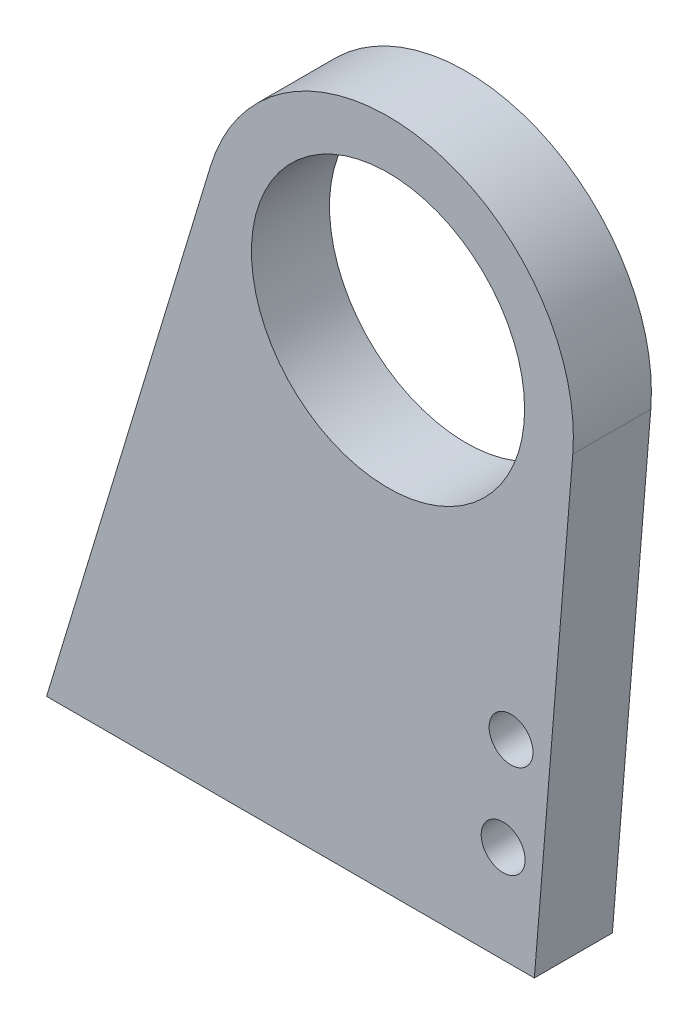
ISO-10303-21;
HEADER;
FILE_DESCRIPTION(('STEP AP214'),'2;1');
FILE_NAME('part.step','',(''),(''),'','','');
FILE_SCHEMA(('AUTOMOTIVE_DESIGN { 1 0 10303 214 1 1 1 1 }'));
ENDSEC;
DATA;
#1=APPLICATION_CONTEXT('core data for automotive mechanical design processes');
#2=APPLICATION_PROTOCOL_DEFINITION('international standard','automotive_design',2000,#1);
#3=PRODUCT_CONTEXT('',#1,'mechanical');
#4=PRODUCT('Part','Part','',(#3));
#5=PRODUCT_RELATED_PRODUCT_CATEGORY('part','',(#4));
#6=PRODUCT_DEFINITION_FORMATION('','',#4);
#7=PRODUCT_DEFINITION_CONTEXT('part definition',#1,'design');
#8=PRODUCT_DEFINITION('design','',#6,#7);
#9=PRODUCT_DEFINITION_SHAPE('','',#8);
#10=(LENGTH_UNIT() NAMED_UNIT(*) SI_UNIT(.MILLI.,.METRE.));
#11=(NAMED_UNIT(*) PLANE_ANGLE_UNIT() SI_UNIT($,.RADIAN.));
#12=(NAMED_UNIT(*) SI_UNIT($,.STERADIAN.) SOLID_ANGLE_UNIT());
#13=UNCERTAINTY_MEASURE_WITH_UNIT(LENGTH_MEASURE(1.E-05),#10,'distance_accuracy_value','');
#14=(GEOMETRIC_REPRESENTATION_CONTEXT(3) GLOBAL_UNCERTAINTY_ASSIGNED_CONTEXT((#13)) GLOBAL_UNIT_ASSIGNED_CONTEXT((#10,
#11,#12)) REPRESENTATION_CONTEXT('',''));
#15=CARTESIAN_POINT('',(0.,0.,0.));
#16=DIRECTION('',(0.,0.,1.));
#17=DIRECTION('',(1.,0.,0.));
#18=AXIS2_PLACEMENT_3D('',#15,#16,#17);
#19=CARTESIAN_POINT('',(49.6720681360177,-4.03597000629349,8.));
#20=DIRECTION('',(-0.99671528668941,0.0809854139931767,0.));
#21=DIRECTION('',(-0.0809854139931767,-0.996715286689411,0.));
#22=AXIS2_PLACEMENT_3D('',#19,#20,#21);
#23=PLANE('',#22);
#24=DIRECTION('',(0.0809854139931767,0.996715286689411,0.));
#25=VECTOR('',#24,1.);
#26=CARTESIAN_POINT('',(49.6720681360177,-4.03597000629349,0.));
#27=LINE('',#26,#25);
#28=CARTESIAN_POINT('',(50.,0.,0.));
#29=VERTEX_POINT('',#28);
#30=CARTESIAN_POINT('',(53.9375904470988,48.4612771341296,0.));
#31=VERTEX_POINT('',#30);
#32=EDGE_CURVE('E128',#29,#31,#27,.T.);
#33=ORIENTED_EDGE('',*,*,#32,.T.);
#34=DIRECTION('',(0.,0.,-1.));
#35=VECTOR('',#34,1.);
#36=CARTESIAN_POINT('',(53.9375904470988,48.4612771341296,8.));
#37=LINE('',#36,#35);
#38=CARTESIAN_POINT('',(53.9375904470988,48.4612771341296,8.));
#39=VERTEX_POINT('',#38);
#40=EDGE_CURVE('E11',#39,#31,#37,.T.);
#41=ORIENTED_EDGE('',*,*,#40,.F.);
#42=DIRECTION('',(0.0809854139931767,0.996715286689411,0.));
#43=VECTOR('',#42,1.);
#44=CARTESIAN_POINT('',(49.6720681360177,-4.03597000629349,8.));
#45=LINE('',#44,#43);
#46=CARTESIAN_POINT('',(50.,0.,8.));
#47=VERTEX_POINT('',#46);
#48=EDGE_CURVE('E129',#47,#39,#45,.T.);
#49=ORIENTED_EDGE('',*,*,#48,.F.);
#50=DIRECTION('',(0.,0.,-1.));
#51=VECTOR('',#50,1.);
#52=CARTESIAN_POINT('',(50.,0.,8.));
#53=LINE('',#52,#51);
#54=EDGE_CURVE('E140',#47,#29,#53,.T.);
#55=ORIENTED_EDGE('',*,*,#54,.T.);
#56=EDGE_LOOP('',(#33,#41,#49,#55));
#57=FACE_BOUND('',#56,.T.);
#58=ADVANCED_FACE('F40',(#57),#23,.F.);
#59=CARTESIAN_POINT('',(35.,50.,8.));
#60=DIRECTION('',(0.,0.,-1.));
#61=DIRECTION('',(-1.,0.,0.));
#62=AXIS2_PLACEMENT_3D('',#59,#60,#61);
#63=CYLINDRICAL_SURFACE('',#62,19.);
#64=CARTESIAN_POINT('',(35.,50.,0.));
#65=DIRECTION('',(0.,0.,1.));
#66=DIRECTION('',(1.,0.,0.));
#67=AXIS2_PLACEMENT_3D('',#64,#65,#66);
#68=CIRCLE('',#67,19.);
#69=CARTESIAN_POINT('',(16.8161073825503,55.5087248322148,0.));
#70=VERTEX_POINT('',#69);
#71=EDGE_CURVE('E143',#31,#70,#68,.T.);
#72=ORIENTED_EDGE('',*,*,#71,.T.);
#73=DIRECTION('',(0.,0.,-1.));
#74=VECTOR('',#73,1.);
#75=CARTESIAN_POINT('',(16.8161073825503,55.5087248322148,8.));
#76=LINE('',#75,#74);
#77=CARTESIAN_POINT('',(16.8161073825503,55.5087248322148,8.));
#78=VERTEX_POINT('',#77);
#79=EDGE_CURVE('E48',#78,#70,#76,.T.);
#80=ORIENTED_EDGE('',*,*,#79,.F.);
#81=CARTESIAN_POINT('',(35.,50.,8.));
#82=DIRECTION('',(0.,0.,1.));
#83=DIRECTION('',(1.,0.,0.));
#84=AXIS2_PLACEMENT_3D('',#81,#82,#83);
#85=CIRCLE('',#84,19.);
#86=EDGE_CURVE('E83',#39,#78,#85,.T.);
#87=ORIENTED_EDGE('',*,*,#86,.F.);
#88=ORIENTED_EDGE('',*,*,#40,.T.);
#89=EDGE_LOOP('',(#72,#80,#87,#88));
#90=FACE_BOUND('',#89,.T.);
#91=ADVANCED_FACE('F156',(#90),#63,.T.);
#92=CARTESIAN_POINT('',(0.,0.,8.));
#93=DIRECTION('',(-0.957046979865772,0.28993288590604,0.));
#94=DIRECTION('',(-0.28993288590604,-0.957046979865772,0.));
#95=AXIS2_PLACEMENT_3D('',#92,#93,#94);
#96=PLANE('',#95);
#97=DIRECTION('',(0.28993288590604,0.957046979865772,0.));
#98=VECTOR('',#97,1.);
#99=CARTESIAN_POINT('',(0.,0.,0.));
#100=LINE('',#99,#98);
#101=CARTESIAN_POINT('',(0.,0.,0.));
#102=VERTEX_POINT('',#101);
#103=EDGE_CURVE('E146',#102,#70,#100,.T.);
#104=ORIENTED_EDGE('',*,*,#103,.F.);
#105=DIRECTION('',(0.,0.,-1.));
#106=VECTOR('',#105,1.);
#107=CARTESIAN_POINT('',(0.,0.,8.));
#108=LINE('',#107,#106);
#109=CARTESIAN_POINT('',(0.,0.,8.));
#110=VERTEX_POINT('',#109);
#111=EDGE_CURVE('E73',#110,#102,#108,.T.);
#112=ORIENTED_EDGE('',*,*,#111,.F.);
#113=DIRECTION('',(0.28993288590604,0.957046979865772,0.));
#114=VECTOR('',#113,1.);
#115=CARTESIAN_POINT('',(0.,0.,8.));
#116=LINE('',#115,#114);
#117=EDGE_CURVE('E133',#110,#78,#116,.T.);
#118=ORIENTED_EDGE('',*,*,#117,.T.);
#119=ORIENTED_EDGE('',*,*,#79,.T.);
#120=EDGE_LOOP('',(#104,#112,#118,#119));
#121=FACE_BOUND('',#120,.T.);
#122=ADVANCED_FACE('F155',(#121),#96,.T.);
#123=CARTESIAN_POINT('',(0.,0.,8.));
#124=DIRECTION('',(0.,1.,0.));
#125=DIRECTION('',(0.,0.,1.));
#126=AXIS2_PLACEMENT_3D('',#123,#124,#125);
#127=PLANE('',#126);
#128=CARTESIAN_POINT('',(10.,0.,4.));
#129=DIRECTION('',(0.,-1.,0.));
#130=DIRECTION('',(0.,0.,-1.));
#131=AXIS2_PLACEMENT_3D('',#128,#129,#130);
#132=CIRCLE('',#131,1.525);
#133=CARTESIAN_POINT('',(10.,0.,2.475));
#134=VERTEX_POINT('',#133);
#135=EDGE_CURVE('E107',#134,#134,#132,.T.);
#136=ORIENTED_EDGE('',*,*,#135,.F.);
#137=EDGE_LOOP('',(#136));
#138=FACE_BOUND('',#137,.T.);
#139=CARTESIAN_POINT('',(40.,0.,4.));
#140=DIRECTION('',(0.,-1.,0.));
#141=DIRECTION('',(0.,0.,-1.));
#142=AXIS2_PLACEMENT_3D('',#139,#140,#141);
#143=CIRCLE('',#142,1.525);
#144=CARTESIAN_POINT('',(40.,0.,2.475));
#145=VERTEX_POINT('',#144);
#146=EDGE_CURVE('E100',#145,#145,#143,.T.);
#147=ORIENTED_EDGE('',*,*,#146,.F.);
#148=EDGE_LOOP('',(#147));
#149=FACE_BOUND('',#148,.T.);
#150=DIRECTION('',(1.,0.,0.));
#151=VECTOR('',#150,1.);
#152=CARTESIAN_POINT('',(0.,0.,0.));
#153=LINE('',#152,#151);
#154=EDGE_CURVE('E76',#102,#29,#153,.T.);
#155=ORIENTED_EDGE('',*,*,#154,.T.);
#156=ORIENTED_EDGE('',*,*,#54,.F.);
#157=DIRECTION('',(1.,0.,0.));
#158=VECTOR('',#157,1.);
#159=CARTESIAN_POINT('',(0.,0.,8.));
#160=LINE('',#159,#158);
#161=EDGE_CURVE('E56',#110,#47,#160,.T.);
#162=ORIENTED_EDGE('',*,*,#161,.F.);
#163=ORIENTED_EDGE('',*,*,#111,.T.);
#164=EDGE_LOOP('',(#155,#156,#162,#163));
#165=FACE_BOUND('',#164,.T.);
#166=ADVANCED_FACE('F164',(#138,#149,#165),#127,.F.);
#167=CARTESIAN_POINT('',(35.,50.,8.));
#168=DIRECTION('',(0.,0.,-1.));
#169=DIRECTION('',(-1.,0.,0.));
#170=AXIS2_PLACEMENT_3D('',#167,#168,#169);
#171=CYLINDRICAL_SURFACE('',#170,14.);
#172=CARTESIAN_POINT('',(35.,50.,8.));
#173=DIRECTION('',(0.,0.,1.));
#174=DIRECTION('',(1.,0.,0.));
#175=AXIS2_PLACEMENT_3D('',#172,#173,#174);
#176=CIRCLE('',#175,14.);
#177=CARTESIAN_POINT('',(49.,50.,8.));
#178=VERTEX_POINT('',#177);
#179=EDGE_CURVE('E137',#178,#178,#176,.T.);
#180=ORIENTED_EDGE('',*,*,#179,.T.);
#181=EDGE_LOOP('',(#180));
#182=FACE_BOUND('',#181,.T.);
#183=CARTESIAN_POINT('',(35.,50.,0.));
#184=DIRECTION('',(0.,0.,1.));
#185=DIRECTION('',(1.,0.,0.));
#186=AXIS2_PLACEMENT_3D('',#183,#184,#185);
#187=CIRCLE('',#186,14.);
#188=CARTESIAN_POINT('',(49.,50.,0.));
#189=VERTEX_POINT('',#188);
#190=EDGE_CURVE('E131',#189,#189,#187,.T.);
#191=ORIENTED_EDGE('',*,*,#190,.F.);
#192=EDGE_LOOP('',(#191));
#193=FACE_BOUND('',#192,.T.);
#194=ADVANCED_FACE('F168',(#182,#193),#171,.F.);
#195=CARTESIAN_POINT('',(0.,0.,8.));
#196=DIRECTION('',(0.,0.,1.));
#197=DIRECTION('',(1.,0.,0.));
#198=AXIS2_PLACEMENT_3D('',#195,#196,#197);
#199=PLANE('',#198);
#200=CARTESIAN_POINT('',(46.7993408923582,10.,8.));
#201=DIRECTION('',(0.,0.,1.));
#202=DIRECTION('',(1.,0.,0.));
#203=AXIS2_PLACEMENT_3D('',#200,#201,#202);
#204=CIRCLE('',#203,2.24999999999999);
#205=CARTESIAN_POINT('',(49.0493408923582,10.,8.));
#206=VERTEX_POINT('',#205);
#207=EDGE_CURVE('E116',#206,#206,#204,.T.);
#208=ORIENTED_EDGE('',*,*,#207,.F.);
#209=EDGE_LOOP('',(#208));
#210=FACE_BOUND('',#209,.T.);
#211=CARTESIAN_POINT('',(47.60919503229,19.9671528668941,8.));
#212=DIRECTION('',(0.,0.,1.));
#213=DIRECTION('',(1.,0.,0.));
#214=AXIS2_PLACEMENT_3D('',#211,#212,#213);
#215=CIRCLE('',#214,2.24999999999999);
#216=CARTESIAN_POINT('',(49.85919503229,19.9671528668941,8.));
#217=VERTEX_POINT('',#216);
#218=EDGE_CURVE('E122',#217,#217,#215,.T.);
#219=ORIENTED_EDGE('',*,*,#218,.F.);
#220=EDGE_LOOP('',(#219));
#221=FACE_BOUND('',#220,.T.);
#222=ORIENTED_EDGE('',*,*,#48,.T.);
#223=ORIENTED_EDGE('',*,*,#86,.T.);
#224=ORIENTED_EDGE('',*,*,#117,.F.);
#225=ORIENTED_EDGE('',*,*,#161,.T.);
#226=EDGE_LOOP('',(#222,#223,#224,#225));
#227=FACE_BOUND('',#226,.T.);
#228=ORIENTED_EDGE('',*,*,#179,.F.);
#229=EDGE_LOOP('',(#228));
#230=FACE_BOUND('',#229,.T.);
#231=ADVANCED_FACE('F165',(#210,#221,#227,#230),#199,.T.);
#232=CARTESIAN_POINT('',(0.,0.,0.));
#233=DIRECTION('',(0.,0.,1.));
#234=DIRECTION('',(1.,0.,0.));
#235=AXIS2_PLACEMENT_3D('',#232,#233,#234);
#236=PLANE('',#235);
#237=CARTESIAN_POINT('',(46.7993408923582,10.,0.));
#238=DIRECTION('',(0.,0.,1.));
#239=DIRECTION('',(1.,0.,0.));
#240=AXIS2_PLACEMENT_3D('',#237,#238,#239);
#241=CIRCLE('',#240,2.24999999999999);
#242=CARTESIAN_POINT('',(49.0493408923582,10.,0.));
#243=VERTEX_POINT('',#242);
#244=EDGE_CURVE('E119',#243,#243,#241,.T.);
#245=ORIENTED_EDGE('',*,*,#244,.T.);
#246=EDGE_LOOP('',(#245));
#247=FACE_BOUND('',#246,.T.);
#248=CARTESIAN_POINT('',(47.60919503229,19.9671528668941,0.));
#249=DIRECTION('',(0.,0.,1.));
#250=DIRECTION('',(1.,0.,0.));
#251=AXIS2_PLACEMENT_3D('',#248,#249,#250);
#252=CIRCLE('',#251,2.25);
#253=CARTESIAN_POINT('',(49.85919503229,19.9671528668941,0.));
#254=VERTEX_POINT('',#253);
#255=EDGE_CURVE('E125',#254,#254,#252,.T.);
#256=ORIENTED_EDGE('',*,*,#255,.T.);
#257=EDGE_LOOP('',(#256));
#258=FACE_BOUND('',#257,.T.);
#259=ORIENTED_EDGE('',*,*,#32,.F.);
#260=ORIENTED_EDGE('',*,*,#154,.F.);
#261=ORIENTED_EDGE('',*,*,#103,.T.);
#262=ORIENTED_EDGE('',*,*,#71,.F.);
#263=EDGE_LOOP('',(#259,#260,#261,#262));
#264=FACE_BOUND('',#263,.T.);
#265=ORIENTED_EDGE('',*,*,#190,.T.);
#266=EDGE_LOOP('',(#265));
#267=FACE_BOUND('',#266,.T.);
#268=ADVANCED_FACE('F160',(#247,#258,#264,#267),#236,.F.);
#269=CARTESIAN_POINT('',(47.60919503229,19.9671528668941,8.));
#270=DIRECTION('',(0.,0.,1.));
#271=DIRECTION('',(1.,0.,0.));
#272=AXIS2_PLACEMENT_3D('',#269,#270,#271);
#273=CYLINDRICAL_SURFACE('',#272,2.25);
#274=ORIENTED_EDGE('',*,*,#255,.F.);
#275=EDGE_LOOP('',(#274));
#276=FACE_BOUND('',#275,.T.);
#277=ORIENTED_EDGE('',*,*,#218,.T.);
#278=EDGE_LOOP('',(#277));
#279=FACE_BOUND('',#278,.T.);
#280=ADVANCED_FACE('F178',(#276,#279),#273,.F.);
#281=CARTESIAN_POINT('',(46.7993408923582,10.,8.));
#282=DIRECTION('',(0.,0.,1.));
#283=DIRECTION('',(1.,0.,0.));
#284=AXIS2_PLACEMENT_3D('',#281,#282,#283);
#285=CYLINDRICAL_SURFACE('',#284,2.24999999999999);
#286=ORIENTED_EDGE('',*,*,#244,.F.);
#287=EDGE_LOOP('',(#286));
#288=FACE_BOUND('',#287,.T.);
#289=ORIENTED_EDGE('',*,*,#207,.T.);
#290=EDGE_LOOP('',(#289));
#291=FACE_BOUND('',#290,.T.);
#292=ADVANCED_FACE('F184',(#288,#291),#285,.F.);
#293=CARTESIAN_POINT('',(40.,8.49999999999999,4.));
#294=DIRECTION('',(0.,-1.,0.));
#295=DIRECTION('',(0.,0.,-1.));
#296=AXIS2_PLACEMENT_3D('',#293,#294,#295);
#297=CONICAL_SURFACE('',#296,1.24999999999999,1.02974425867665);
#298=CARTESIAN_POINT('',(40.,9.25107577378444,4.));
#299=VERTEX_POINT('',#298);
#300=VERTEX_LOOP('',#299);
#301=FACE_BOUND('',#300,.T.);
#302=CARTESIAN_POINT('',(40.,8.49999999999999,4.));
#303=DIRECTION('',(0.,-1.,0.));
#304=DIRECTION('',(0.,0.,-1.));
#305=AXIS2_PLACEMENT_3D('',#302,#303,#304);
#306=CIRCLE('',#305,1.24999999999999);
#307=CARTESIAN_POINT('',(40.,8.49999999999999,2.75000000000001));
#308=VERTEX_POINT('',#307);
#309=EDGE_CURVE('E113',#308,#308,#306,.T.);
#310=ORIENTED_EDGE('',*,*,#309,.T.);
#311=EDGE_LOOP('',(#310));
#312=FACE_BOUND('',#311,.T.);
#313=ADVANCED_FACE('F213',(#301,#312),#297,.F.);
#314=CARTESIAN_POINT('',(40.,0.,4.));
#315=DIRECTION('',(0.,-1.,0.));
#316=DIRECTION('',(0.,0.,-1.));
#317=AXIS2_PLACEMENT_3D('',#314,#315,#316);
#318=CYLINDRICAL_SURFACE('',#317,1.24999999999999);
#319=ORIENTED_EDGE('',*,*,#309,.F.);
#320=EDGE_LOOP('',(#319));
#321=FACE_BOUND('',#320,.T.);
#322=CARTESIAN_POINT('',(40.,0.275000000000001,4.));
#323=DIRECTION('',(0.,-1.,0.));
#324=DIRECTION('',(0.,0.,-1.));
#325=AXIS2_PLACEMENT_3D('',#322,#323,#324);
#326=CIRCLE('',#325,1.25);
#327=CARTESIAN_POINT('',(40.,0.275000000000001,2.75));
#328=VERTEX_POINT('',#327);
#329=EDGE_CURVE('E104',#328,#328,#326,.T.);
#330=ORIENTED_EDGE('',*,*,#329,.T.);
#331=EDGE_LOOP('',(#330));
#332=FACE_BOUND('',#331,.T.);
#333=ADVANCED_FACE('F207',(#321,#332),#318,.F.);
#334=CARTESIAN_POINT('',(40.,0.,4.));
#335=DIRECTION('',(0.,-1.,0.));
#336=DIRECTION('',(0.,0.,-1.));
#337=AXIS2_PLACEMENT_3D('',#334,#335,#336);
#338=CONICAL_SURFACE('',#337,1.525,0.785398163397439);
#339=ORIENTED_EDGE('',*,*,#329,.F.);
#340=EDGE_LOOP('',(#339));
#341=FACE_BOUND('',#340,.T.);
#342=ORIENTED_EDGE('',*,*,#146,.T.);
#343=EDGE_LOOP('',(#342));
#344=FACE_BOUND('',#343,.T.);
#345=ADVANCED_FACE('F94',(#341,#344),#338,.F.);
#346=CARTESIAN_POINT('',(10.,8.49999999999999,4.));
#347=DIRECTION('',(0.,-1.,0.));
#348=DIRECTION('',(0.,0.,-1.));
#349=AXIS2_PLACEMENT_3D('',#346,#347,#348);
#350=CONICAL_SURFACE('',#349,1.24999999999999,1.02974425867665);
#351=CARTESIAN_POINT('',(10.,9.25107577378444,4.));
#352=VERTEX_POINT('',#351);
#353=VERTEX_LOOP('',#352);
#354=FACE_BOUND('',#353,.T.);
#355=CARTESIAN_POINT('',(10.,8.49999999999999,4.));
#356=DIRECTION('',(0.,-1.,0.));
#357=DIRECTION('',(0.,0.,-1.));
#358=AXIS2_PLACEMENT_3D('',#355,#356,#357);
#359=CIRCLE('',#358,1.24999999999999);
#360=CARTESIAN_POINT('',(10.,8.49999999999999,2.75000000000001));
#361=VERTEX_POINT('',#360);
#362=EDGE_CURVE('E98',#361,#361,#359,.T.);
#363=ORIENTED_EDGE('',*,*,#362,.T.);
#364=EDGE_LOOP('',(#363));
#365=FACE_BOUND('',#364,.T.);
#366=ADVANCED_FACE('F90',(#354,#365),#350,.F.);
#367=CARTESIAN_POINT('',(10.,0.,4.));
#368=DIRECTION('',(0.,-1.,0.));
#369=DIRECTION('',(0.,0.,-1.));
#370=AXIS2_PLACEMENT_3D('',#367,#368,#369);
#371=CYLINDRICAL_SURFACE('',#370,1.24999999999999);
#372=ORIENTED_EDGE('',*,*,#362,.F.);
#373=EDGE_LOOP('',(#372));
#374=FACE_BOUND('',#373,.T.);
#375=CARTESIAN_POINT('',(10.,0.275000000000001,4.));
#376=DIRECTION('',(0.,-1.,0.));
#377=DIRECTION('',(0.,0.,-1.));
#378=AXIS2_PLACEMENT_3D('',#375,#376,#377);
#379=CIRCLE('',#378,1.25);
#380=CARTESIAN_POINT('',(10.,0.275000000000001,2.75));
#381=VERTEX_POINT('',#380);
#382=EDGE_CURVE('E101',#381,#381,#379,.T.);
#383=ORIENTED_EDGE('',*,*,#382,.T.);
#384=EDGE_LOOP('',(#383));
#385=FACE_BOUND('',#384,.T.);
#386=ADVANCED_FACE('F93',(#374,#385),#371,.F.);
#387=CARTESIAN_POINT('',(10.,0.,4.));
#388=DIRECTION('',(0.,-1.,0.));
#389=DIRECTION('',(0.,0.,-1.));
#390=AXIS2_PLACEMENT_3D('',#387,#388,#389);
#391=CONICAL_SURFACE('',#390,1.525,0.785398163397445);
#392=ORIENTED_EDGE('',*,*,#382,.F.);
#393=EDGE_LOOP('',(#392));
#394=FACE_BOUND('',#393,.T.);
#395=ORIENTED_EDGE('',*,*,#135,.T.);
#396=EDGE_LOOP('',(#395));
#397=FACE_BOUND('',#396,.T.);
#398=ADVANCED_FACE('F252',(#394,#397),#391,.F.);
#399=CLOSED_SHELL('',(#58,#91,#122,#166,#194,#231,#268,#280,#292,#313,#333,#345,#366,#386,#398));
#400=MANIFOLD_SOLID_BREP('B2',#399);
#401=ADVANCED_BREP_SHAPE_REPRESENTATION('',(#18,#400),#14);
#402=SHAPE_DEFINITION_REPRESENTATION(#9,#401);
ENDSEC;
END-ISO-10303-21;
